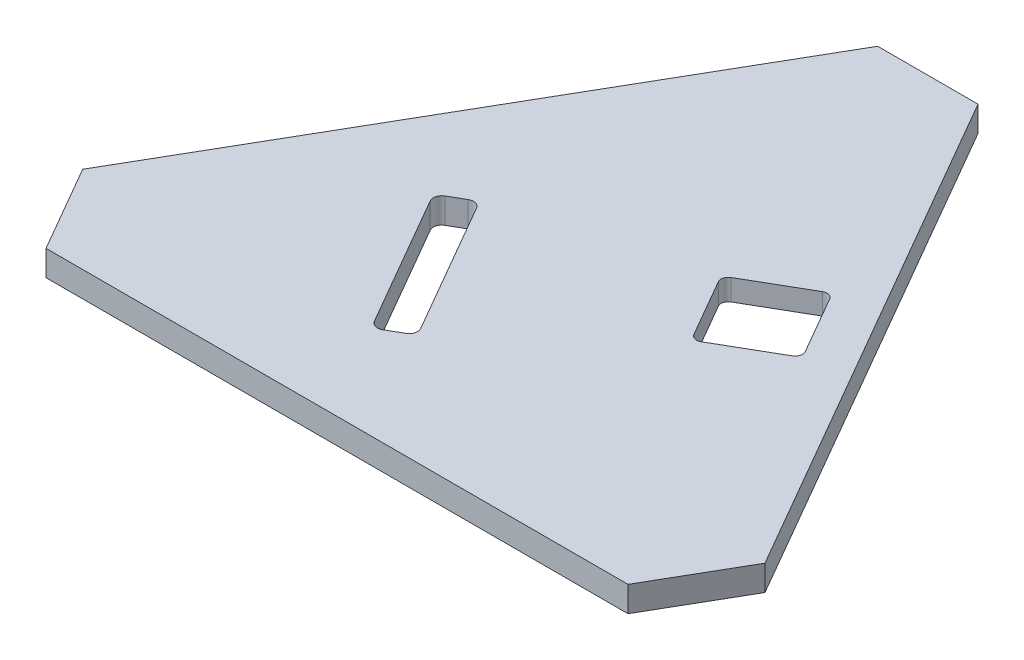
ISO-10303-21;
HEADER;
FILE_DESCRIPTION(('STEP AP214'),'2;1');
FILE_NAME('part.step','',(''),(''),'','','');
FILE_SCHEMA(('AUTOMOTIVE_DESIGN { 1 0 10303 214 1 1 1 1 }'));
ENDSEC;
DATA;
#1=APPLICATION_CONTEXT('core data for automotive mechanical design processes');
#2=APPLICATION_PROTOCOL_DEFINITION('international standard','automotive_design',2000,#1);
#3=PRODUCT_CONTEXT('',#1,'mechanical');
#4=PRODUCT('Part','Part','',(#3));
#5=PRODUCT_RELATED_PRODUCT_CATEGORY('part','',(#4));
#6=PRODUCT_DEFINITION_FORMATION('','',#4);
#7=PRODUCT_DEFINITION_CONTEXT('part definition',#1,'design');
#8=PRODUCT_DEFINITION('design','',#6,#7);
#9=PRODUCT_DEFINITION_SHAPE('','',#8);
#10=(LENGTH_UNIT() NAMED_UNIT(*) SI_UNIT(.MILLI.,.METRE.));
#11=(NAMED_UNIT(*) PLANE_ANGLE_UNIT() SI_UNIT($,.RADIAN.));
#12=(NAMED_UNIT(*) SI_UNIT($,.STERADIAN.) SOLID_ANGLE_UNIT());
#13=UNCERTAINTY_MEASURE_WITH_UNIT(LENGTH_MEASURE(1.E-05),#10,'distance_accuracy_value','');
#14=(GEOMETRIC_REPRESENTATION_CONTEXT(3) GLOBAL_UNCERTAINTY_ASSIGNED_CONTEXT((#13)) GLOBAL_UNIT_ASSIGNED_CONTEXT((#10,
#11,#12)) REPRESENTATION_CONTEXT('',''));
#15=CARTESIAN_POINT('',(0.,0.,0.));
#16=DIRECTION('',(0.,0.,1.));
#17=DIRECTION('',(1.,0.,0.));
#18=AXIS2_PLACEMENT_3D('',#15,#16,#17);
#19=CARTESIAN_POINT('',(1577.09998333721,19.05,13173.8984050004));
#20=DIRECTION('',(-0.866025403784439,0.,0.499999999999999));
#21=DIRECTION('',(0.499999999999999,0.,0.866025403784439));
#22=AXIS2_PLACEMENT_3D('',#19,#20,#21);
#23=PLANE('',#22);
#24=DIRECTION('',(-0.499999999999999,0.,-0.866025403784439));
#25=VECTOR('',#24,1.);
#26=CARTESIAN_POINT('',(1577.09998333721,0.,13173.8984050004));
#27=LINE('',#26,#25);
#28=CARTESIAN_POINT('',(1577.09998333721,0.,13173.8984050004));
#29=VERTEX_POINT('',#28);
#30=CARTESIAN_POINT('',(1359.2891177106,0.,12796.6389192945));
#31=VERTEX_POINT('',#30);
#32=EDGE_CURVE('E398',#29,#31,#27,.T.);
#33=ORIENTED_EDGE('',*,*,#32,.T.);
#34=DIRECTION('',(0.,-1.,0.));
#35=VECTOR('',#34,1.);
#36=CARTESIAN_POINT('',(1359.2891177106,19.05,12796.6389192945));
#37=LINE('',#36,#35);
#38=CARTESIAN_POINT('',(1359.2891177106,19.05,12796.6389192945));
#39=VERTEX_POINT('',#38);
#40=EDGE_CURVE('E45',#39,#31,#37,.T.);
#41=ORIENTED_EDGE('',*,*,#40,.F.);
#42=DIRECTION('',(-0.499999999999999,0.,-0.866025403784439));
#43=VECTOR('',#42,1.);
#44=CARTESIAN_POINT('',(1577.09998333721,19.05,13173.8984050004));
#45=LINE('',#44,#43);
#46=CARTESIAN_POINT('',(1577.09998333721,19.05,13173.8984050004));
#47=VERTEX_POINT('',#46);
#48=EDGE_CURVE('E412',#47,#39,#45,.T.);
#49=ORIENTED_EDGE('',*,*,#48,.F.);
#50=DIRECTION('',(0.,-1.,0.));
#51=VECTOR('',#50,1.);
#52=CARTESIAN_POINT('',(1577.09998333721,19.05,13173.8984050004));
#53=LINE('',#52,#51);
#54=EDGE_CURVE('E426',#47,#29,#53,.T.);
#55=ORIENTED_EDGE('',*,*,#54,.T.);
#56=EDGE_LOOP('',(#33,#41,#49,#55));
#57=FACE_BOUND('',#56,.T.);
#58=ADVANCED_FACE('F38',(#57),#23,.F.);
#59=CARTESIAN_POINT('',(1359.2891177106,19.05,12796.6389192945));
#60=DIRECTION('',(0.,0.,1.));
#61=DIRECTION('',(1.,0.,0.));
#62=AXIS2_PLACEMENT_3D('',#59,#60,#61);
#63=PLANE('',#62);
#64=DIRECTION('',(-1.,0.,0.));
#65=VECTOR('',#64,1.);
#66=CARTESIAN_POINT('',(1359.2891177106,0.,12796.6389192945));
#67=LINE('',#66,#65);
#68=CARTESIAN_POINT('',(1284.23263960455,0.,12796.6389192945));
#69=VERTEX_POINT('',#68);
#70=EDGE_CURVE('E429',#31,#69,#67,.T.);
#71=ORIENTED_EDGE('',*,*,#70,.T.);
#72=DIRECTION('',(0.,-1.,0.));
#73=VECTOR('',#72,1.);
#74=CARTESIAN_POINT('',(1284.23263960455,19.05,12796.6389192945));
#75=LINE('',#74,#73);
#76=CARTESIAN_POINT('',(1284.23263960455,19.05,12796.6389192945));
#77=VERTEX_POINT('',#76);
#78=EDGE_CURVE('E449',#77,#69,#75,.T.);
#79=ORIENTED_EDGE('',*,*,#78,.F.);
#80=DIRECTION('',(-1.,0.,0.));
#81=VECTOR('',#80,1.);
#82=CARTESIAN_POINT('',(1359.2891177106,19.05,12796.6389192945));
#83=LINE('',#82,#81);
#84=EDGE_CURVE('E415',#39,#77,#83,.T.);
#85=ORIENTED_EDGE('',*,*,#84,.F.);
#86=ORIENTED_EDGE('',*,*,#40,.T.);
#87=EDGE_LOOP('',(#71,#79,#85,#86));
#88=FACE_BOUND('',#87,.T.);
#89=ADVANCED_FACE('F454',(#88),#63,.F.);
#90=CARTESIAN_POINT('',(1284.23263960455,19.05,12796.6389192945));
#91=DIRECTION('',(0.866025403784439,0.,0.5));
#92=DIRECTION('',(0.5,0.,-0.866025403784438));
#93=AXIS2_PLACEMENT_3D('',#90,#91,#92);
#94=PLANE('',#93);
#95=DIRECTION('',(-0.5,0.,0.866025403784438));
#96=VECTOR('',#95,1.);
#97=CARTESIAN_POINT('',(1284.23263960455,0.,12796.6389192945));
#98=LINE('',#97,#96);
#99=CARTESIAN_POINT('',(1066.4217739783,0.,13173.8984049997));
#100=VERTEX_POINT('',#99);
#101=EDGE_CURVE('E431',#69,#100,#98,.T.);
#102=ORIENTED_EDGE('',*,*,#101,.T.);
#103=DIRECTION('',(0.,-1.,0.));
#104=VECTOR('',#103,1.);
#105=CARTESIAN_POINT('',(1066.4217739783,19.05,13173.8984049997));
#106=LINE('',#105,#104);
#107=CARTESIAN_POINT('',(1066.4217739783,19.05,13173.8984049997));
#108=VERTEX_POINT('',#107);
#109=EDGE_CURVE('E446',#108,#100,#106,.T.);
#110=ORIENTED_EDGE('',*,*,#109,.F.);
#111=DIRECTION('',(-0.5,0.,0.866025403784438));
#112=VECTOR('',#111,1.);
#113=CARTESIAN_POINT('',(1284.23263960455,19.05,12796.6389192945));
#114=LINE('',#113,#112);
#115=EDGE_CURVE('E418',#77,#108,#114,.T.);
#116=ORIENTED_EDGE('',*,*,#115,.F.);
#117=ORIENTED_EDGE('',*,*,#78,.T.);
#118=EDGE_LOOP('',(#102,#110,#116,#117));
#119=FACE_BOUND('',#118,.T.);
#120=ADVANCED_FACE('F468',(#119),#94,.F.);
#121=CARTESIAN_POINT('',(1066.4217739783,19.05,13173.8984049997));
#122=DIRECTION('',(0.866025403784449,0.,-0.499999999999983));
#123=DIRECTION('',(-0.499999999999983,0.,-0.866025403784449));
#124=AXIS2_PLACEMENT_3D('',#121,#122,#123);
#125=PLANE('',#124);
#126=DIRECTION('',(0.499999999999983,0.,0.866025403784449));
#127=VECTOR('',#126,1.);
#128=CARTESIAN_POINT('',(1066.4217739783,0.,13173.8984049997));
#129=LINE('',#128,#127);
#130=CARTESIAN_POINT('',(1103.95001303204,0.,13238.8992217594));
#131=VERTEX_POINT('',#130);
#132=EDGE_CURVE('E433',#100,#131,#129,.T.);
#133=ORIENTED_EDGE('',*,*,#132,.T.);
#134=DIRECTION('',(0.,-1.,0.));
#135=VECTOR('',#134,1.);
#136=CARTESIAN_POINT('',(1103.95001303204,19.05,13238.8992217594));
#137=LINE('',#136,#135);
#138=CARTESIAN_POINT('',(1103.95001303204,19.05,13238.8992217594));
#139=VERTEX_POINT('',#138);
#140=EDGE_CURVE('E443',#139,#131,#137,.T.);
#141=ORIENTED_EDGE('',*,*,#140,.F.);
#142=DIRECTION('',(0.499999999999983,0.,0.866025403784449));
#143=VECTOR('',#142,1.);
#144=CARTESIAN_POINT('',(1066.4217739783,19.05,13173.8984049997));
#145=LINE('',#144,#143);
#146=EDGE_CURVE('E420',#108,#139,#145,.T.);
#147=ORIENTED_EDGE('',*,*,#146,.F.);
#148=ORIENTED_EDGE('',*,*,#109,.T.);
#149=EDGE_LOOP('',(#133,#141,#147,#148));
#150=FACE_BOUND('',#149,.T.);
#151=ADVANCED_FACE('F472',(#150),#125,.F.);
#152=CARTESIAN_POINT('',(1103.95001303204,19.05,13238.8992217594));
#153=DIRECTION('',(0.,0.,-1.));
#154=DIRECTION('',(-1.,0.,0.));
#155=AXIS2_PLACEMENT_3D('',#152,#153,#154);
#156=PLANE('',#155);
#157=DIRECTION('',(1.,0.,0.));
#158=VECTOR('',#157,1.);
#159=CARTESIAN_POINT('',(1103.95001303204,0.,13238.8992217594));
#160=LINE('',#159,#158);
#161=CARTESIAN_POINT('',(1539.57174428383,0.,13238.8992217594));
#162=VERTEX_POINT('',#161);
#163=EDGE_CURVE('E435',#131,#162,#160,.T.);
#164=ORIENTED_EDGE('',*,*,#163,.T.);
#165=DIRECTION('',(0.,-1.,0.));
#166=VECTOR('',#165,1.);
#167=CARTESIAN_POINT('',(1539.57174428383,19.05,13238.8992217594));
#168=LINE('',#167,#166);
#169=CARTESIAN_POINT('',(1539.57174428383,19.05,13238.8992217594));
#170=VERTEX_POINT('',#169);
#171=EDGE_CURVE('E440',#170,#162,#168,.T.);
#172=ORIENTED_EDGE('',*,*,#171,.F.);
#173=DIRECTION('',(1.,0.,0.));
#174=VECTOR('',#173,1.);
#175=CARTESIAN_POINT('',(1103.95001303204,19.05,13238.8992217594));
#176=LINE('',#175,#174);
#177=EDGE_CURVE('E422',#139,#170,#176,.T.);
#178=ORIENTED_EDGE('',*,*,#177,.F.);
#179=ORIENTED_EDGE('',*,*,#140,.T.);
#180=EDGE_LOOP('',(#164,#172,#178,#179));
#181=FACE_BOUND('',#180,.T.);
#182=ADVANCED_FACE('F481',(#181),#156,.F.);
#183=CARTESIAN_POINT('',(1539.57174428383,19.05,13238.8992217594));
#184=DIRECTION('',(-0.866025403784441,0.,-0.499999999999997));
#185=DIRECTION('',(-0.499999999999997,0.,0.866025403784441));
#186=AXIS2_PLACEMENT_3D('',#183,#184,#185);
#187=PLANE('',#186);
#188=DIRECTION('',(0.499999999999997,0.,-0.866025403784441));
#189=VECTOR('',#188,1.);
#190=CARTESIAN_POINT('',(1539.57174428383,0.,13238.8992217594));
#191=LINE('',#190,#189);
#192=EDGE_CURVE('E416',#162,#29,#191,.T.);
#193=ORIENTED_EDGE('',*,*,#192,.T.);
#194=ORIENTED_EDGE('',*,*,#54,.F.);
#195=DIRECTION('',(0.499999999999997,0.,-0.866025403784441));
#196=VECTOR('',#195,1.);
#197=CARTESIAN_POINT('',(1539.57174428383,19.05,13238.8992217594));
#198=LINE('',#197,#196);
#199=EDGE_CURVE('E424',#170,#47,#198,.T.);
#200=ORIENTED_EDGE('',*,*,#199,.F.);
#201=ORIENTED_EDGE('',*,*,#171,.T.);
#202=EDGE_LOOP('',(#193,#194,#200,#201));
#203=FACE_BOUND('',#202,.T.);
#204=ADVANCED_FACE('F479',(#203),#187,.F.);
#205=CARTESIAN_POINT('',(0.,19.05,0.));
#206=DIRECTION('',(0.,1.,0.));
#207=DIRECTION('',(0.,0.,1.));
#208=AXIS2_PLACEMENT_3D('',#205,#206,#207);
#209=PLANE('',#208);
#210=CARTESIAN_POINT('',(1279.61369632783,19.05,13160.136945889));
#211=DIRECTION('',(0.,1.,0.));
#212=DIRECTION('',(0.,0.,-1.));
#213=AXIS2_PLACEMENT_3D('',#210,#211,#212);
#214=CIRCLE('',#213,6.34999999999939);
#215=CARTESIAN_POINT('',(1274.1144350138,19.05,13163.311945889));
#216=VERTEX_POINT('',#215);
#217=CARTESIAN_POINT('',(1282.78869632783,19.05,13165.6362072031));
#218=VERTEX_POINT('',#217);
#219=EDGE_CURVE('E52',#216,#218,#214,.T.);
#220=ORIENTED_EDGE('',*,*,#219,.F.);
#221=DIRECTION('',(0.500000000000004,0.,0.866025403784436));
#222=VECTOR('',#221,1.);
#223=CARTESIAN_POINT('',(1216.9644350138,19.05,13064.3252422365));
#224=LINE('',#223,#222);
#225=CARTESIAN_POINT('',(1216.9644350138,19.05,13064.3252422365));
#226=VERTEX_POINT('',#225);
#227=EDGE_CURVE('E268',#226,#216,#224,.T.);
#228=ORIENTED_EDGE('',*,*,#227,.F.);
#229=CARTESIAN_POINT('',(1222.46369632783,19.05,13061.1502422365));
#230=DIRECTION('',(0.,1.,0.));
#231=DIRECTION('',(0.,0.,-1.));
#232=AXIS2_PLACEMENT_3D('',#229,#230,#231);
#233=CIRCLE('',#232,6.35000000000039);
#234=CARTESIAN_POINT('',(1219.28869632783,19.05,13055.6509809224));
#235=VERTEX_POINT('',#234);
#236=EDGE_CURVE('E265',#235,#226,#233,.T.);
#237=ORIENTED_EDGE('',*,*,#236,.F.);
#238=DIRECTION('',(-0.866025403784465,0.,0.499999999999955));
#239=VECTOR('',#238,1.);
#240=CARTESIAN_POINT('',(1219.28869632783,19.05,13055.6509809224));
#241=LINE('',#240,#239);
#242=CARTESIAN_POINT('',(1230.2872189559,19.05,13049.3009809224));
#243=VERTEX_POINT('',#242);
#244=EDGE_CURVE('E262',#243,#235,#241,.T.);
#245=ORIENTED_EDGE('',*,*,#244,.F.);
#246=CARTESIAN_POINT('',(1233.4622189559,19.05,13054.8002422365));
#247=DIRECTION('',(0.,1.,0.));
#248=DIRECTION('',(0.,0.,1.));
#249=AXIS2_PLACEMENT_3D('',#246,#247,#248);
#250=CIRCLE('',#249,6.34999999999939);
#251=CARTESIAN_POINT('',(1238.96148026993,19.05,13051.6252422365));
#252=VERTEX_POINT('',#251);
#253=EDGE_CURVE('E256',#252,#243,#250,.T.);
#254=ORIENTED_EDGE('',*,*,#253,.F.);
#255=DIRECTION('',(-0.500000000000004,0.,-0.866025403784436));
#256=VECTOR('',#255,1.);
#257=CARTESIAN_POINT('',(1238.96148026993,19.05,13051.6252422365));
#258=LINE('',#257,#256);
#259=CARTESIAN_POINT('',(1296.11148026993,19.05,13150.611945889));
#260=VERTEX_POINT('',#259);
#261=EDGE_CURVE('E254',#260,#252,#258,.T.);
#262=ORIENTED_EDGE('',*,*,#261,.F.);
#263=CARTESIAN_POINT('',(1290.6122189559,19.05,13153.786945889));
#264=DIRECTION('',(0.,1.,0.));
#265=DIRECTION('',(0.,0.,-1.));
#266=AXIS2_PLACEMENT_3D('',#263,#264,#265);
#267=CIRCLE('',#266,6.35000000000039);
#268=CARTESIAN_POINT('',(1293.7872189559,19.05,13159.2862072031));
#269=VERTEX_POINT('',#268);
#270=EDGE_CURVE('E237',#269,#260,#267,.T.);
#271=ORIENTED_EDGE('',*,*,#270,.F.);
#272=DIRECTION('',(0.866025403784465,0.,-0.499999999999955));
#273=VECTOR('',#272,1.);
#274=CARTESIAN_POINT('',(1282.78869632783,19.05,13165.6362072031));
#275=LINE('',#274,#273);
#276=EDGE_CURVE('E246',#218,#269,#275,.T.);
#277=ORIENTED_EDGE('',*,*,#276,.F.);
#278=EDGE_LOOP('',(#220,#228,#237,#245,#254,#262,#271,#277));
#279=FACE_BOUND('',#278,.T.);
#280=DIRECTION('',(0.499999999670903,0.,0.866025403974443));
#281=VECTOR('',#280,1.);
#282=CARTESIAN_POINT('',(-4600.10221260763,19.05,2655.87024841804));
#283=LINE('',#282,#281);
#284=CARTESIAN_POINT('',(1377.23266474137,19.05,13008.9179589257));
#285=VERTEX_POINT('',#284);
#286=CARTESIAN_POINT('',(1402.23266477114,19.05,13052.2192291855));
#287=VERTEX_POINT('',#286);
#288=EDGE_CURVE('E371',#285,#287,#283,.T.);
#289=ORIENTED_EDGE('',*,*,#288,.F.);
#290=CARTESIAN_POINT('',(1381.99580444573,19.05,13006.1679589352));
#291=DIRECTION('',(0.,1.,0.));
#292=DIRECTION('',(0.,0.,1.));
#293=AXIS2_PLACEMENT_3D('',#290,#291,#292);
#294=CIRCLE('',#293,5.49999997149939);
#295=CARTESIAN_POINT('',(1379.24580446473,19.05,13001.4048192473));
#296=VERTEX_POINT('',#295);
#297=EDGE_CURVE('E392',#296,#285,#294,.T.);
#298=ORIENTED_EDGE('',*,*,#297,.F.);
#299=DIRECTION('',(-0.866025403594434,0.,0.500000000329097));
#300=VECTOR('',#299,1.);
#301=CARTESIAN_POINT('',(5974.58488321722,19.05,10348.2845627836));
#302=LINE('',#301,#300);
#303=CARTESIAN_POINT('',(1422.54707464445,19.05,12976.4048192309));
#304=VERTEX_POINT('',#303);
#305=EDGE_CURVE('E389',#304,#296,#302,.T.);
#306=ORIENTED_EDGE('',*,*,#305,.F.);
#307=CARTESIAN_POINT('',(1425.29707463495,19.05,12981.1679589352));
#308=DIRECTION('',(0.,1.,0.));
#309=DIRECTION('',(0.,0.,1.));
#310=AXIS2_PLACEMENT_3D('',#307,#308,#309);
#311=CIRCLE('',#310,5.49999998099929);
#312=CARTESIAN_POINT('',(1430.06021433931,19.05,12978.4179589447));
#313=VERTEX_POINT('',#312);
#314=EDGE_CURVE('E386',#313,#304,#311,.T.);
#315=ORIENTED_EDGE('',*,*,#314,.F.);
#316=DIRECTION('',(-0.499999999999995,0.,-0.866025403784442));
#317=VECTOR('',#316,1.);
#318=CARTESIAN_POINT('',(-4547.27466593463,19.05,2625.37025245649));
#319=LINE('',#318,#317);
#320=CARTESIAN_POINT('',(1455.06021437731,19.05,13021.7192291998));
#321=VERTEX_POINT('',#320);
#322=EDGE_CURVE('E383',#321,#313,#319,.T.);
#323=ORIENTED_EDGE('',*,*,#322,.F.);
#324=CARTESIAN_POINT('',(1450.29707467295,19.05,13024.4692291903));
#325=DIRECTION('',(0.,1.,0.));
#326=DIRECTION('',(0.,0.,1.));
#327=AXIS2_PLACEMENT_3D('',#324,#325,#326);
#328=CIRCLE('',#327,5.49999997149939);
#329=CARTESIAN_POINT('',(1453.04707465395,19.05,13029.2323688782));
#330=VERTEX_POINT('',#329);
#331=EDGE_CURVE('E380',#330,#321,#328,.T.);
#332=ORIENTED_EDGE('',*,*,#331,.F.);
#333=DIRECTION('',(0.866025403594434,0.,-0.500000000329097));
#334=VECTOR('',#333,1.);
#335=CARTESIAN_POINT('',(6005.08488324679,19.05,10401.1121124193));
#336=LINE('',#335,#334);
#337=CARTESIAN_POINT('',(1409.74580447423,19.05,13054.2323688946));
#338=VERTEX_POINT('',#337);
#339=EDGE_CURVE('E377',#338,#330,#336,.T.);
#340=ORIENTED_EDGE('',*,*,#339,.F.);
#341=CARTESIAN_POINT('',(1406.99580448373,19.05,13049.4692291903));
#342=DIRECTION('',(0.,1.,0.));
#343=DIRECTION('',(0.,0.,1.));
#344=AXIS2_PLACEMENT_3D('',#341,#342,#343);
#345=CIRCLE('',#344,5.49999999049934);
#346=EDGE_CURVE('E374',#287,#338,#345,.T.);
#347=ORIENTED_EDGE('',*,*,#346,.F.);
#348=EDGE_LOOP('',(#289,#298,#306,#315,#323,#332,#340,#347));
#349=FACE_BOUND('',#348,.T.);
#350=ORIENTED_EDGE('',*,*,#48,.T.);
#351=ORIENTED_EDGE('',*,*,#84,.T.);
#352=ORIENTED_EDGE('',*,*,#115,.T.);
#353=ORIENTED_EDGE('',*,*,#146,.T.);
#354=ORIENTED_EDGE('',*,*,#177,.T.);
#355=ORIENTED_EDGE('',*,*,#199,.T.);
#356=EDGE_LOOP('',(#350,#351,#352,#353,#354,#355));
#357=FACE_BOUND('',#356,.T.);
#358=ADVANCED_FACE('F250',(#279,#349,#357),#209,.T.);
#359=CARTESIAN_POINT('',(0.,0.,0.));
#360=DIRECTION('',(0.,1.,0.));
#361=DIRECTION('',(0.,0.,1.));
#362=AXIS2_PLACEMENT_3D('',#359,#360,#361);
#363=PLANE('',#362);
#364=DIRECTION('',(-0.500000000000004,0.,-0.866025403784436));
#365=VECTOR('',#364,1.);
#366=CARTESIAN_POINT('',(1216.9644350138,0.,13064.3252422365));
#367=LINE('',#366,#365);
#368=CARTESIAN_POINT('',(1274.1144350138,0.,13163.311945889));
#369=VERTEX_POINT('',#368);
#370=CARTESIAN_POINT('',(1216.9644350138,0.,13064.3252422365));
#371=VERTEX_POINT('',#370);
#372=EDGE_CURVE('E776',#369,#371,#367,.T.);
#373=ORIENTED_EDGE('',*,*,#372,.F.);
#374=CARTESIAN_POINT('',(1279.61369632783,0.,13160.136945889));
#375=DIRECTION('',(0.,1.,0.));
#376=DIRECTION('',(0.,0.,1.));
#377=AXIS2_PLACEMENT_3D('',#374,#375,#376);
#378=CIRCLE('',#377,6.34999999999939);
#379=CARTESIAN_POINT('',(1282.78869632783,0.,13165.6362072031));
#380=VERTEX_POINT('',#379);
#381=EDGE_CURVE('E286',#380,#369,#378,.F.);
#382=ORIENTED_EDGE('',*,*,#381,.F.);
#383=DIRECTION('',(-0.866025403784465,0.,0.499999999999955));
#384=VECTOR('',#383,1.);
#385=CARTESIAN_POINT('',(1282.78869632783,0.,13165.6362072031));
#386=LINE('',#385,#384);
#387=CARTESIAN_POINT('',(1293.7872189559,0.,13159.2862072031));
#388=VERTEX_POINT('',#387);
#389=EDGE_CURVE('E283',#388,#380,#386,.T.);
#390=ORIENTED_EDGE('',*,*,#389,.F.);
#391=CARTESIAN_POINT('',(1290.6122189559,0.,13153.786945889));
#392=DIRECTION('',(0.,1.,0.));
#393=DIRECTION('',(0.,0.,1.));
#394=AXIS2_PLACEMENT_3D('',#391,#392,#393);
#395=CIRCLE('',#394,6.35000000000039);
#396=CARTESIAN_POINT('',(1296.11148026993,0.,13150.611945889));
#397=VERTEX_POINT('',#396);
#398=EDGE_CURVE('E240',#397,#388,#395,.F.);
#399=ORIENTED_EDGE('',*,*,#398,.F.);
#400=DIRECTION('',(0.500000000000004,0.,0.866025403784436));
#401=VECTOR('',#400,1.);
#402=CARTESIAN_POINT('',(1238.96148026993,0.,13051.6252422365));
#403=LINE('',#402,#401);
#404=CARTESIAN_POINT('',(1238.96148026993,0.,13051.6252422365));
#405=VERTEX_POINT('',#404);
#406=EDGE_CURVE('E762',#405,#397,#403,.T.);
#407=ORIENTED_EDGE('',*,*,#406,.F.);
#408=CARTESIAN_POINT('',(1233.4622189559,0.,13054.8002422365));
#409=DIRECTION('',(0.,1.,0.));
#410=DIRECTION('',(0.,0.,1.));
#411=AXIS2_PLACEMENT_3D('',#408,#409,#410);
#412=CIRCLE('',#411,6.34999999999939);
#413=CARTESIAN_POINT('',(1230.2872189559,0.,13049.3009809224));
#414=VERTEX_POINT('',#413);
#415=EDGE_CURVE('E764',#414,#405,#412,.F.);
#416=ORIENTED_EDGE('',*,*,#415,.F.);
#417=DIRECTION('',(0.866025403784465,0.,-0.499999999999955));
#418=VECTOR('',#417,1.);
#419=CARTESIAN_POINT('',(1219.28869632783,0.,13055.6509809224));
#420=LINE('',#419,#418);
#421=CARTESIAN_POINT('',(1219.28869632783,0.,13055.6509809224));
#422=VERTEX_POINT('',#421);
#423=EDGE_CURVE('E772',#422,#414,#420,.T.);
#424=ORIENTED_EDGE('',*,*,#423,.F.);
#425=CARTESIAN_POINT('',(1222.46369632783,0.,13061.1502422365));
#426=DIRECTION('',(0.,1.,0.));
#427=DIRECTION('',(0.,0.,1.));
#428=AXIS2_PLACEMENT_3D('',#425,#426,#427);
#429=CIRCLE('',#428,6.35000000000039);
#430=EDGE_CURVE('E774',#371,#422,#429,.F.);
#431=ORIENTED_EDGE('',*,*,#430,.F.);
#432=EDGE_LOOP('',(#373,#382,#390,#399,#407,#416,#424,#431));
#433=FACE_BOUND('',#432,.T.);
#434=DIRECTION('',(0.500000000000007,0.,0.866025403784435));
#435=VECTOR('',#434,1.);
#436=CARTESIAN_POINT('',(1432.87546841956,0.,12963.2941219719));
#437=LINE('',#436,#435);
#438=CARTESIAN_POINT('',(1432.87546841956,0.,12963.2941219719));
#439=VERTEX_POINT('',#438);
#440=CARTESIAN_POINT('',(1469.56546843856,0.,13026.8430661346));
#441=VERTEX_POINT('',#440);
#442=EDGE_CURVE('E314',#439,#441,#437,.T.);
#443=ORIENTED_EDGE('',*,*,#442,.F.);
#444=CARTESIAN_POINT('',(1429.57591163114,0.,12965.1991219719));
#445=DIRECTION('',(0.,-1.,0.));
#446=DIRECTION('',(0.,0.,1.));
#447=AXIS2_PLACEMENT_3D('',#444,#445,#446);
#448=CIRCLE('',#447,3.80999999999994);
#449=CARTESIAN_POINT('',(1427.67091163114,0.,12961.8995651835));
#450=VERTEX_POINT('',#449);
#451=EDGE_CURVE('E285',#450,#439,#448,.T.);
#452=ORIENTED_EDGE('',*,*,#451,.F.);
#453=DIRECTION('',(0.866025403784449,0.,-0.499999999999983));
#454=VECTOR('',#453,1.);
#455=CARTESIAN_POINT('',(1427.67091163114,0.,12961.8995651835));
#456=LINE('',#455,#454);
#457=CARTESIAN_POINT('',(1364.12196746853,0.,12998.5895652025));
#458=VERTEX_POINT('',#457);
#459=EDGE_CURVE('E291',#458,#450,#456,.T.);
#460=ORIENTED_EDGE('',*,*,#459,.F.);
#461=CARTESIAN_POINT('',(1366.02696746853,0.,13001.8891219909));
#462=DIRECTION('',(0.,-1.,0.));
#463=DIRECTION('',(0.,0.,1.));
#464=AXIS2_PLACEMENT_3D('',#461,#462,#463);
#465=CIRCLE('',#464,3.81000000000021);
#466=CARTESIAN_POINT('',(1362.72741068011,0.,13003.7941219909));
#467=VERTEX_POINT('',#466);
#468=EDGE_CURVE('E329',#467,#458,#465,.T.);
#469=ORIENTED_EDGE('',*,*,#468,.F.);
#470=DIRECTION('',(-0.500000000000005,0.,-0.866025403784436));
#471=VECTOR('',#470,1.);
#472=CARTESIAN_POINT('',(1362.72741068011,0.,13003.7941219909));
#473=LINE('',#472,#471);
#474=CARTESIAN_POINT('',(1399.41741069911,0.,13067.3430661536));
#475=VERTEX_POINT('',#474);
#476=EDGE_CURVE('E326',#475,#467,#473,.T.);
#477=ORIENTED_EDGE('',*,*,#476,.F.);
#478=CARTESIAN_POINT('',(1402.71696748753,0.,13065.4380661536));
#479=DIRECTION('',(0.,-1.,0.));
#480=DIRECTION('',(0.,0.,1.));
#481=AXIS2_PLACEMENT_3D('',#478,#479,#480);
#482=CIRCLE('',#481,3.80999999999994);
#483=CARTESIAN_POINT('',(1404.62196748753,0.,13068.737622942));
#484=VERTEX_POINT('',#483);
#485=EDGE_CURVE('E323',#484,#475,#482,.T.);
#486=ORIENTED_EDGE('',*,*,#485,.F.);
#487=DIRECTION('',(-0.866025403784449,0.,0.499999999999982));
#488=VECTOR('',#487,1.);
#489=CARTESIAN_POINT('',(1468.17091165015,0.,13032.047622923));
#490=LINE('',#489,#488);
#491=CARTESIAN_POINT('',(1468.17091165014,0.,13032.047622923));
#492=VERTEX_POINT('',#491);
#493=EDGE_CURVE('E320',#492,#484,#490,.T.);
#494=ORIENTED_EDGE('',*,*,#493,.F.);
#495=CARTESIAN_POINT('',(1466.26591165015,0.,13028.7480661346));
#496=DIRECTION('',(0.,-1.,0.));
#497=DIRECTION('',(0.,0.,-1.));
#498=AXIS2_PLACEMENT_3D('',#495,#496,#497);
#499=CIRCLE('',#498,3.81000000000021);
#500=EDGE_CURVE('E317',#441,#492,#499,.T.);
#501=ORIENTED_EDGE('',*,*,#500,.F.);
#502=EDGE_LOOP('',(#443,#452,#460,#469,#477,#486,#494,#501));
#503=FACE_BOUND('',#502,.T.);
#504=ORIENTED_EDGE('',*,*,#32,.F.);
#505=ORIENTED_EDGE('',*,*,#192,.F.);
#506=ORIENTED_EDGE('',*,*,#163,.F.);
#507=ORIENTED_EDGE('',*,*,#132,.F.);
#508=ORIENTED_EDGE('',*,*,#101,.F.);
#509=ORIENTED_EDGE('',*,*,#70,.F.);
#510=EDGE_LOOP('',(#504,#505,#506,#507,#508,#509));
#511=FACE_BOUND('',#510,.T.);
#512=ADVANCED_FACE('F462',(#433,#503,#511),#363,.F.);
#513=CARTESIAN_POINT('',(-4600.10221260763,-0.949999999999996,2655.87024841804));
#514=DIRECTION('',(-0.866025403974443,0.,0.499999999670903));
#515=DIRECTION('',(0.499999999670903,0.,0.866025403974443));
#516=AXIS2_PLACEMENT_3D('',#513,#514,#515);
#517=PLANE('',#516);
#518=DIRECTION('',(0.,1.,0.));
#519=VECTOR('',#518,1.);
#520=CARTESIAN_POINT('',(1402.23266476291,-0.949999999999996,13052.2192291903));
#521=LINE('',#520,#519);
#522=CARTESIAN_POINT('',(1402.23266476291,3.175,13052.2192291903));
#523=VERTEX_POINT('',#522);
#524=EDGE_CURVE('E395',#523,#287,#521,.T.);
#525=ORIENTED_EDGE('',*,*,#524,.F.);
#526=DIRECTION('',(-0.499999999670903,0.,-0.866025403974443));
#527=VECTOR('',#526,1.);
#528=CARTESIAN_POINT('',(-4600.10221260763,3.175,2655.87024841804));
#529=LINE('',#528,#527);
#530=CARTESIAN_POINT('',(1377.23266474959,3.175,13008.917958921));
#531=VERTEX_POINT('',#530);
#532=EDGE_CURVE('E368',#523,#531,#529,.T.);
#533=ORIENTED_EDGE('',*,*,#532,.T.);
#534=DIRECTION('',(0.,1.,0.));
#535=VECTOR('',#534,1.);
#536=CARTESIAN_POINT('',(1377.23266474137,-0.949999999999996,13008.9179589257));
#537=LINE('',#536,#535);
#538=EDGE_CURVE('E396',#531,#285,#537,.T.);
#539=ORIENTED_EDGE('',*,*,#538,.T.);
#540=ORIENTED_EDGE('',*,*,#288,.T.);
#541=EDGE_LOOP('',(#525,#533,#539,#540));
#542=FACE_BOUND('',#541,.T.);
#543=ADVANCED_FACE('F521',(#542),#517,.F.);
#544=CARTESIAN_POINT('',(1381.99580444573,-0.949999999999996,13006.1679589352));
#545=DIRECTION('',(0.,1.,0.));
#546=DIRECTION('',(0.,0.,1.));
#547=AXIS2_PLACEMENT_3D('',#544,#545,#546);
#548=CYLINDRICAL_SURFACE('',#547,5.49999997149939);
#549=ORIENTED_EDGE('',*,*,#538,.F.);
#550=CARTESIAN_POINT('',(1381.99580444573,3.175,13006.1679589352));
#551=DIRECTION('',(0.,1.,0.));
#552=DIRECTION('',(0.,0.,1.));
#553=AXIS2_PLACEMENT_3D('',#550,#551,#552);
#554=CIRCLE('',#553,5.49999997149939);
#555=CARTESIAN_POINT('',(1379.24580446473,3.175,13001.4048192473));
#556=VERTEX_POINT('',#555);
#557=EDGE_CURVE('E365',#531,#556,#554,.F.);
#558=ORIENTED_EDGE('',*,*,#557,.T.);
#559=DIRECTION('',(0.,1.,0.));
#560=VECTOR('',#559,1.);
#561=CARTESIAN_POINT('',(1379.24580446473,-0.949999999999996,13001.4048192473));
#562=LINE('',#561,#560);
#563=EDGE_CURVE('E399',#556,#296,#562,.T.);
#564=ORIENTED_EDGE('',*,*,#563,.T.);
#565=ORIENTED_EDGE('',*,*,#297,.T.);
#566=EDGE_LOOP('',(#549,#558,#564,#565));
#567=FACE_BOUND('',#566,.T.);
#568=ADVANCED_FACE('F525',(#567),#548,.F.);
#569=CARTESIAN_POINT('',(5974.58488321722,-0.949999999999996,10348.2845627836));
#570=DIRECTION('',(-0.500000000329097,0.,-0.866025403594434));
#571=DIRECTION('',(-0.866025403594434,0.,0.500000000329097));
#572=AXIS2_PLACEMENT_3D('',#569,#570,#571);
#573=PLANE('',#572);
#574=ORIENTED_EDGE('',*,*,#563,.F.);
#575=DIRECTION('',(0.866025403594434,0.,-0.500000000329097));
#576=VECTOR('',#575,1.);
#577=CARTESIAN_POINT('',(5974.58488321722,3.175,10348.2845627836));
#578=LINE('',#577,#576);
#579=CARTESIAN_POINT('',(1422.54707464445,3.175,12976.4048192309));
#580=VERTEX_POINT('',#579);
#581=EDGE_CURVE('E362',#556,#580,#578,.T.);
#582=ORIENTED_EDGE('',*,*,#581,.T.);
#583=DIRECTION('',(0.,1.,0.));
#584=VECTOR('',#583,1.);
#585=CARTESIAN_POINT('',(1422.54707464445,-0.949999999999996,12976.4048192309));
#586=LINE('',#585,#584);
#587=EDGE_CURVE('E401',#580,#304,#586,.T.);
#588=ORIENTED_EDGE('',*,*,#587,.T.);
#589=ORIENTED_EDGE('',*,*,#305,.T.);
#590=EDGE_LOOP('',(#574,#582,#588,#589));
#591=FACE_BOUND('',#590,.T.);
#592=ADVANCED_FACE('F534',(#591),#573,.F.);
#593=CARTESIAN_POINT('',(1425.29707463495,-0.949999999999996,12981.1679589352));
#594=DIRECTION('',(0.,1.,0.));
#595=DIRECTION('',(0.,0.,1.));
#596=AXIS2_PLACEMENT_3D('',#593,#594,#595);
#597=CYLINDRICAL_SURFACE('',#596,5.49999998099929);
#598=ORIENTED_EDGE('',*,*,#587,.F.);
#599=CARTESIAN_POINT('',(1425.29707463495,3.175,12981.1679589352));
#600=DIRECTION('',(0.,1.,0.));
#601=DIRECTION('',(0.,0.,1.));
#602=AXIS2_PLACEMENT_3D('',#599,#600,#601);
#603=CIRCLE('',#602,5.49999998099929);
#604=CARTESIAN_POINT('',(1430.06021433931,3.175,12978.4179589447));
#605=VERTEX_POINT('',#604);
#606=EDGE_CURVE('E359',#580,#605,#603,.F.);
#607=ORIENTED_EDGE('',*,*,#606,.T.);
#608=DIRECTION('',(0.,1.,0.));
#609=VECTOR('',#608,1.);
#610=CARTESIAN_POINT('',(1430.06021433931,-0.949999999999996,12978.4179589447));
#611=LINE('',#610,#609);
#612=EDGE_CURVE('E403',#605,#313,#611,.T.);
#613=ORIENTED_EDGE('',*,*,#612,.T.);
#614=ORIENTED_EDGE('',*,*,#314,.T.);
#615=EDGE_LOOP('',(#598,#607,#613,#614));
#616=FACE_BOUND('',#615,.T.);
#617=ADVANCED_FACE('F542',(#616),#597,.F.);
#618=CARTESIAN_POINT('',(-4547.27466593463,-0.949999999999996,2625.37025245649));
#619=DIRECTION('',(0.866025403784442,0.,-0.499999999999995));
#620=DIRECTION('',(-0.499999999999995,0.,-0.866025403784442));
#621=AXIS2_PLACEMENT_3D('',#618,#619,#620);
#622=PLANE('',#621);
#623=ORIENTED_EDGE('',*,*,#612,.F.);
#624=DIRECTION('',(0.499999999999995,0.,0.866025403784442));
#625=VECTOR('',#624,1.);
#626=CARTESIAN_POINT('',(-4547.27466593463,3.175,2625.37025245649));
#627=LINE('',#626,#625);
#628=CARTESIAN_POINT('',(1455.06021436908,3.175,13021.7192292045));
#629=VERTEX_POINT('',#628);
#630=EDGE_CURVE('E356',#605,#629,#627,.T.);
#631=ORIENTED_EDGE('',*,*,#630,.T.);
#632=DIRECTION('',(0.,1.,0.));
#633=VECTOR('',#632,1.);
#634=CARTESIAN_POINT('',(1455.06021437731,-0.949999999999996,13021.7192291998));
#635=LINE('',#634,#633);
#636=EDGE_CURVE('E405',#629,#321,#635,.T.);
#637=ORIENTED_EDGE('',*,*,#636,.T.);
#638=ORIENTED_EDGE('',*,*,#322,.T.);
#639=EDGE_LOOP('',(#623,#631,#637,#638));
#640=FACE_BOUND('',#639,.T.);
#641=ADVANCED_FACE('F550',(#640),#622,.F.);
#642=CARTESIAN_POINT('',(1450.29707467295,-0.949999999999996,13024.4692291903));
#643=DIRECTION('',(0.,1.,0.));
#644=DIRECTION('',(0.,0.,1.));
#645=AXIS2_PLACEMENT_3D('',#642,#643,#644);
#646=CYLINDRICAL_SURFACE('',#645,5.49999997149939);
#647=ORIENTED_EDGE('',*,*,#636,.F.);
#648=CARTESIAN_POINT('',(1450.29707467295,3.175,13024.4692291903));
#649=DIRECTION('',(0.,1.,0.));
#650=DIRECTION('',(0.,0.,1.));
#651=AXIS2_PLACEMENT_3D('',#648,#649,#650);
#652=CIRCLE('',#651,5.49999997149939);
#653=CARTESIAN_POINT('',(1453.04707465395,3.175,13029.2323688782));
#654=VERTEX_POINT('',#653);
#655=EDGE_CURVE('E353',#629,#654,#652,.F.);
#656=ORIENTED_EDGE('',*,*,#655,.T.);
#657=DIRECTION('',(0.,1.,0.));
#658=VECTOR('',#657,1.);
#659=CARTESIAN_POINT('',(1453.04707465395,-0.949999999999996,13029.2323688782));
#660=LINE('',#659,#658);
#661=EDGE_CURVE('E407',#654,#330,#660,.T.);
#662=ORIENTED_EDGE('',*,*,#661,.T.);
#663=ORIENTED_EDGE('',*,*,#331,.T.);
#664=EDGE_LOOP('',(#647,#656,#662,#663));
#665=FACE_BOUND('',#664,.T.);
#666=ADVANCED_FACE('F558',(#665),#646,.F.);
#667=CARTESIAN_POINT('',(6005.08488324679,-0.949999999999996,10401.1121124193));
#668=DIRECTION('',(0.500000000329097,0.,0.866025403594434));
#669=DIRECTION('',(0.866025403594434,0.,-0.500000000329097));
#670=AXIS2_PLACEMENT_3D('',#667,#668,#669);
#671=PLANE('',#670);
#672=ORIENTED_EDGE('',*,*,#661,.F.);
#673=DIRECTION('',(-0.866025403594434,0.,0.500000000329097));
#674=VECTOR('',#673,1.);
#675=CARTESIAN_POINT('',(6005.08488324679,3.175,10401.1121124193));
#676=LINE('',#675,#674);
#677=CARTESIAN_POINT('',(1409.74580447898,3.175,13054.2323689029));
#678=VERTEX_POINT('',#677);
#679=EDGE_CURVE('E336',#654,#678,#676,.T.);
#680=ORIENTED_EDGE('',*,*,#679,.T.);
#681=DIRECTION('',(0.,1.,0.));
#682=VECTOR('',#681,1.);
#683=CARTESIAN_POINT('',(1409.74580447423,-0.949999999999996,13054.2323688946));
#684=LINE('',#683,#682);
#685=EDGE_CURVE('E409',#678,#338,#684,.T.);
#686=ORIENTED_EDGE('',*,*,#685,.T.);
#687=ORIENTED_EDGE('',*,*,#339,.T.);
#688=EDGE_LOOP('',(#672,#680,#686,#687));
#689=FACE_BOUND('',#688,.T.);
#690=ADVANCED_FACE('F566',(#689),#671,.F.);
#691=CARTESIAN_POINT('',(1406.99580448373,-0.949999999999996,13049.4692291903));
#692=DIRECTION('',(0.,1.,0.));
#693=DIRECTION('',(0.,0.,1.));
#694=AXIS2_PLACEMENT_3D('',#691,#692,#693);
#695=CYLINDRICAL_SURFACE('',#694,5.49999999049934);
#696=ORIENTED_EDGE('',*,*,#685,.F.);
#697=CARTESIAN_POINT('',(1406.99580448373,3.175,13049.4692291903));
#698=DIRECTION('',(0.,1.,0.));
#699=DIRECTION('',(0.,0.,1.));
#700=AXIS2_PLACEMENT_3D('',#697,#698,#699);
#701=CIRCLE('',#700,5.49999999049934);
#702=EDGE_CURVE('E11',#678,#523,#701,.F.);
#703=ORIENTED_EDGE('',*,*,#702,.T.);
#704=ORIENTED_EDGE('',*,*,#524,.T.);
#705=ORIENTED_EDGE('',*,*,#346,.T.);
#706=EDGE_LOOP('',(#696,#703,#704,#705));
#707=FACE_BOUND('',#706,.T.);
#708=ADVANCED_FACE('F574',(#707),#695,.F.);
#709=CARTESIAN_POINT('',(1429.57591163114,3.175,12965.1991219719));
#710=DIRECTION('',(0.,1.,0.));
#711=DIRECTION('',(0.,0.,1.));
#712=AXIS2_PLACEMENT_3D('',#709,#710,#711);
#713=PLANE('',#712);
#714=CARTESIAN_POINT('',(1429.57591163114,3.175,12965.1991219719));
#715=DIRECTION('',(0.,-1.,0.));
#716=DIRECTION('',(0.,0.,1.));
#717=AXIS2_PLACEMENT_3D('',#714,#715,#716);
#718=CIRCLE('',#717,3.80999999999994);
#719=CARTESIAN_POINT('',(1427.67091163114,3.175,12961.8995651835));
#720=VERTEX_POINT('',#719);
#721=CARTESIAN_POINT('',(1432.87546841956,3.175,12963.2941219719));
#722=VERTEX_POINT('',#721);
#723=EDGE_CURVE('E287',#720,#722,#718,.T.);
#724=ORIENTED_EDGE('',*,*,#723,.T.);
#725=DIRECTION('',(0.500000000000007,0.,0.866025403784435));
#726=VECTOR('',#725,1.);
#727=CARTESIAN_POINT('',(1432.87546841956,3.175,12963.2941219719));
#728=LINE('',#727,#726);
#729=CARTESIAN_POINT('',(1469.56546843856,3.175,13026.8430661346));
#730=VERTEX_POINT('',#729);
#731=EDGE_CURVE('E290',#722,#730,#728,.T.);
#732=ORIENTED_EDGE('',*,*,#731,.T.);
#733=CARTESIAN_POINT('',(1466.26591165015,3.175,13028.7480661346));
#734=DIRECTION('',(0.,-1.,0.));
#735=DIRECTION('',(0.,0.,-1.));
#736=AXIS2_PLACEMENT_3D('',#733,#734,#735);
#737=CIRCLE('',#736,3.81000000000021);
#738=CARTESIAN_POINT('',(1468.17091165014,3.175,13032.047622923));
#739=VERTEX_POINT('',#738);
#740=EDGE_CURVE('E294',#730,#739,#737,.T.);
#741=ORIENTED_EDGE('',*,*,#740,.T.);
#742=DIRECTION('',(-0.866025403784449,0.,0.499999999999982));
#743=VECTOR('',#742,1.);
#744=CARTESIAN_POINT('',(1468.17091165015,3.175,13032.047622923));
#745=LINE('',#744,#743);
#746=CARTESIAN_POINT('',(1404.62196748753,3.175,13068.737622942));
#747=VERTEX_POINT('',#746);
#748=EDGE_CURVE('E297',#739,#747,#745,.T.);
#749=ORIENTED_EDGE('',*,*,#748,.T.);
#750=CARTESIAN_POINT('',(1402.71696748753,3.175,13065.4380661536));
#751=DIRECTION('',(0.,-1.,0.));
#752=DIRECTION('',(0.,0.,1.));
#753=AXIS2_PLACEMENT_3D('',#750,#751,#752);
#754=CIRCLE('',#753,3.80999999999994);
#755=CARTESIAN_POINT('',(1399.41741069911,3.175,13067.3430661536));
#756=VERTEX_POINT('',#755);
#757=EDGE_CURVE('E300',#747,#756,#754,.T.);
#758=ORIENTED_EDGE('',*,*,#757,.T.);
#759=DIRECTION('',(-0.500000000000005,0.,-0.866025403784436));
#760=VECTOR('',#759,1.);
#761=CARTESIAN_POINT('',(1362.72741068011,3.175,13003.7941219909));
#762=LINE('',#761,#760);
#763=CARTESIAN_POINT('',(1362.72741068011,3.175,13003.7941219909));
#764=VERTEX_POINT('',#763);
#765=EDGE_CURVE('E303',#756,#764,#762,.T.);
#766=ORIENTED_EDGE('',*,*,#765,.T.);
#767=CARTESIAN_POINT('',(1366.02696746853,3.175,13001.8891219909));
#768=DIRECTION('',(0.,-1.,0.));
#769=DIRECTION('',(0.,0.,1.));
#770=AXIS2_PLACEMENT_3D('',#767,#768,#769);
#771=CIRCLE('',#770,3.81000000000021);
#772=CARTESIAN_POINT('',(1364.12196746853,3.175,12998.5895652025));
#773=VERTEX_POINT('',#772);
#774=EDGE_CURVE('E306',#764,#773,#771,.T.);
#775=ORIENTED_EDGE('',*,*,#774,.T.);
#776=DIRECTION('',(0.866025403784449,0.,-0.499999999999983));
#777=VECTOR('',#776,1.);
#778=CARTESIAN_POINT('',(1427.67091163114,3.175,12961.8995651835));
#779=LINE('',#778,#777);
#780=EDGE_CURVE('E309',#773,#720,#779,.T.);
#781=ORIENTED_EDGE('',*,*,#780,.T.);
#782=EDGE_LOOP('',(#724,#732,#741,#749,#758,#766,#775,#781));
#783=FACE_BOUND('',#782,.T.);
#784=ORIENTED_EDGE('',*,*,#702,.F.);
#785=ORIENTED_EDGE('',*,*,#679,.F.);
#786=ORIENTED_EDGE('',*,*,#655,.F.);
#787=ORIENTED_EDGE('',*,*,#630,.F.);
#788=ORIENTED_EDGE('',*,*,#606,.F.);
#789=ORIENTED_EDGE('',*,*,#581,.F.);
#790=ORIENTED_EDGE('',*,*,#557,.F.);
#791=ORIENTED_EDGE('',*,*,#532,.F.);
#792=EDGE_LOOP('',(#784,#785,#786,#787,#788,#789,#790,#791));
#793=FACE_BOUND('',#792,.T.);
#794=ADVANCED_FACE('F582',(#783,#793),#713,.F.);
#795=CARTESIAN_POINT('',(1429.57591163114,3.175,12965.1991219719));
#796=DIRECTION('',(0.,-1.,0.));
#797=DIRECTION('',(0.,0.,-1.));
#798=AXIS2_PLACEMENT_3D('',#795,#796,#797);
#799=CYLINDRICAL_SURFACE('',#798,3.80999999999994);
#800=ORIENTED_EDGE('',*,*,#451,.T.);
#801=DIRECTION('',(0.,-1.,0.));
#802=VECTOR('',#801,1.);
#803=CARTESIAN_POINT('',(1432.87546841956,3.175,12963.2941219719));
#804=LINE('',#803,#802);
#805=EDGE_CURVE('E312',#722,#439,#804,.T.);
#806=ORIENTED_EDGE('',*,*,#805,.F.);
#807=ORIENTED_EDGE('',*,*,#723,.F.);
#808=DIRECTION('',(0.,-1.,0.));
#809=VECTOR('',#808,1.);
#810=CARTESIAN_POINT('',(1427.67091163114,3.175,12961.8995651835));
#811=LINE('',#810,#809);
#812=EDGE_CURVE('E334',#720,#450,#811,.T.);
#813=ORIENTED_EDGE('',*,*,#812,.T.);
#814=EDGE_LOOP('',(#800,#806,#807,#813));
#815=FACE_BOUND('',#814,.T.);
#816=ADVANCED_FACE('F591',(#815),#799,.F.);
#817=CARTESIAN_POINT('',(1427.67091163114,3.175,12961.8995651835));
#818=DIRECTION('',(-0.499999999999983,0.,-0.866025403784449));
#819=DIRECTION('',(-0.866025403784449,0.,0.499999999999983));
#820=AXIS2_PLACEMENT_3D('',#817,#818,#819);
#821=PLANE('',#820);
#822=ORIENTED_EDGE('',*,*,#459,.T.);
#823=ORIENTED_EDGE('',*,*,#812,.F.);
#824=ORIENTED_EDGE('',*,*,#780,.F.);
#825=DIRECTION('',(0.,-1.,0.));
#826=VECTOR('',#825,1.);
#827=CARTESIAN_POINT('',(1364.12196746853,3.175,12998.5895652025));
#828=LINE('',#827,#826);
#829=EDGE_CURVE('E337',#773,#458,#828,.T.);
#830=ORIENTED_EDGE('',*,*,#829,.T.);
#831=EDGE_LOOP('',(#822,#823,#824,#830));
#832=FACE_BOUND('',#831,.T.);
#833=ADVANCED_FACE('F601',(#832),#821,.F.);
#834=CARTESIAN_POINT('',(1366.02696746853,3.175,13001.8891219909));
#835=DIRECTION('',(0.,-1.,0.));
#836=DIRECTION('',(0.,0.,-1.));
#837=AXIS2_PLACEMENT_3D('',#834,#835,#836);
#838=CYLINDRICAL_SURFACE('',#837,3.81000000000021);
#839=ORIENTED_EDGE('',*,*,#468,.T.);
#840=ORIENTED_EDGE('',*,*,#829,.F.);
#841=ORIENTED_EDGE('',*,*,#774,.F.);
#842=DIRECTION('',(0.,-1.,0.));
#843=VECTOR('',#842,1.);
#844=CARTESIAN_POINT('',(1362.72741068011,3.175,13003.7941219909));
#845=LINE('',#844,#843);
#846=EDGE_CURVE('E339',#764,#467,#845,.T.);
#847=ORIENTED_EDGE('',*,*,#846,.T.);
#848=EDGE_LOOP('',(#839,#840,#841,#847));
#849=FACE_BOUND('',#848,.T.);
#850=ADVANCED_FACE('F611',(#849),#838,.F.);
#851=CARTESIAN_POINT('',(1362.72741068011,3.175,13003.7941219909));
#852=DIRECTION('',(-0.866025403784436,0.,0.500000000000005));
#853=DIRECTION('',(0.500000000000005,0.,0.866025403784436));
#854=AXIS2_PLACEMENT_3D('',#851,#852,#853);
#855=PLANE('',#854);
#856=ORIENTED_EDGE('',*,*,#476,.T.);
#857=ORIENTED_EDGE('',*,*,#846,.F.);
#858=ORIENTED_EDGE('',*,*,#765,.F.);
#859=DIRECTION('',(0.,-1.,0.));
#860=VECTOR('',#859,1.);
#861=CARTESIAN_POINT('',(1399.41741069911,3.175,13067.3430661536));
#862=LINE('',#861,#860);
#863=EDGE_CURVE('E341',#756,#475,#862,.T.);
#864=ORIENTED_EDGE('',*,*,#863,.T.);
#865=EDGE_LOOP('',(#856,#857,#858,#864));
#866=FACE_BOUND('',#865,.T.);
#867=ADVANCED_FACE('F621',(#866),#855,.F.);
#868=CARTESIAN_POINT('',(1402.71696748753,3.175,13065.4380661536));
#869=DIRECTION('',(0.,-1.,0.));
#870=DIRECTION('',(0.,0.,-1.));
#871=AXIS2_PLACEMENT_3D('',#868,#869,#870);
#872=CYLINDRICAL_SURFACE('',#871,3.80999999999994);
#873=ORIENTED_EDGE('',*,*,#485,.T.);
#874=ORIENTED_EDGE('',*,*,#863,.F.);
#875=ORIENTED_EDGE('',*,*,#757,.F.);
#876=DIRECTION('',(0.,-1.,0.));
#877=VECTOR('',#876,1.);
#878=CARTESIAN_POINT('',(1404.62196748753,3.175,13068.737622942));
#879=LINE('',#878,#877);
#880=EDGE_CURVE('E343',#747,#484,#879,.T.);
#881=ORIENTED_EDGE('',*,*,#880,.T.);
#882=EDGE_LOOP('',(#873,#874,#875,#881));
#883=FACE_BOUND('',#882,.T.);
#884=ADVANCED_FACE('F631',(#883),#872,.F.);
#885=CARTESIAN_POINT('',(1468.17091165015,3.175,13032.047622923));
#886=DIRECTION('',(0.499999999999981,0.,0.866025403784449));
#887=DIRECTION('',(0.866025403784449,0.,-0.499999999999981));
#888=AXIS2_PLACEMENT_3D('',#885,#886,#887);
#889=PLANE('',#888);
#890=ORIENTED_EDGE('',*,*,#493,.T.);
#891=ORIENTED_EDGE('',*,*,#880,.F.);
#892=ORIENTED_EDGE('',*,*,#748,.F.);
#893=DIRECTION('',(0.,-1.,0.));
#894=VECTOR('',#893,1.);
#895=CARTESIAN_POINT('',(1468.17091165014,3.175,13032.047622923));
#896=LINE('',#895,#894);
#897=EDGE_CURVE('E345',#739,#492,#896,.T.);
#898=ORIENTED_EDGE('',*,*,#897,.T.);
#899=EDGE_LOOP('',(#890,#891,#892,#898));
#900=FACE_BOUND('',#899,.T.);
#901=ADVANCED_FACE('F641',(#900),#889,.F.);
#902=CARTESIAN_POINT('',(1466.26591165015,3.175,13028.7480661346));
#903=DIRECTION('',(0.,-1.,0.));
#904=DIRECTION('',(0.,0.,-1.));
#905=AXIS2_PLACEMENT_3D('',#902,#903,#904);
#906=CYLINDRICAL_SURFACE('',#905,3.81000000000021);
#907=ORIENTED_EDGE('',*,*,#500,.T.);
#908=ORIENTED_EDGE('',*,*,#897,.F.);
#909=ORIENTED_EDGE('',*,*,#740,.F.);
#910=DIRECTION('',(0.,-1.,0.));
#911=VECTOR('',#910,1.);
#912=CARTESIAN_POINT('',(1469.56546843856,3.175,13026.8430661346));
#913=LINE('',#912,#911);
#914=EDGE_CURVE('E347',#730,#441,#913,.T.);
#915=ORIENTED_EDGE('',*,*,#914,.T.);
#916=EDGE_LOOP('',(#907,#908,#909,#915));
#917=FACE_BOUND('',#916,.T.);
#918=ADVANCED_FACE('F651',(#917),#906,.F.);
#919=CARTESIAN_POINT('',(1432.87546841956,3.175,12963.2941219719));
#920=DIRECTION('',(0.866025403784435,0.,-0.500000000000007));
#921=DIRECTION('',(-0.500000000000007,0.,-0.866025403784435));
#922=AXIS2_PLACEMENT_3D('',#919,#920,#921);
#923=PLANE('',#922);
#924=ORIENTED_EDGE('',*,*,#442,.T.);
#925=ORIENTED_EDGE('',*,*,#914,.F.);
#926=ORIENTED_EDGE('',*,*,#731,.F.);
#927=ORIENTED_EDGE('',*,*,#805,.T.);
#928=EDGE_LOOP('',(#924,#925,#926,#927));
#929=FACE_BOUND('',#928,.T.);
#930=ADVANCED_FACE('F661',(#929),#923,.F.);
#931=CARTESIAN_POINT('',(1279.61369632783,-143.070426784515,13160.136945889));
#932=DIRECTION('',(0.,1.,0.));
#933=DIRECTION('',(0.,0.,1.));
#934=AXIS2_PLACEMENT_3D('',#931,#932,#933);
#935=CYLINDRICAL_SURFACE('',#934,6.34999999999939);
#936=ORIENTED_EDGE('',*,*,#381,.T.);
#937=DIRECTION('',(0.,1.,0.));
#938=VECTOR('',#937,1.);
#939=CARTESIAN_POINT('',(1274.1144350138,-143.070426784515,13163.311945889));
#940=LINE('',#939,#938);
#941=EDGE_CURVE('E271',#369,#216,#940,.T.);
#942=ORIENTED_EDGE('',*,*,#941,.T.);
#943=ORIENTED_EDGE('',*,*,#219,.T.);
#944=DIRECTION('',(0.,1.,0.));
#945=VECTOR('',#944,1.);
#946=CARTESIAN_POINT('',(1282.78869632783,-143.070426784515,13165.6362072031));
#947=LINE('',#946,#945);
#948=EDGE_CURVE('E243',#380,#218,#947,.T.);
#949=ORIENTED_EDGE('',*,*,#948,.F.);
#950=EDGE_LOOP('',(#936,#942,#943,#949));
#951=FACE_BOUND('',#950,.T.);
#952=ADVANCED_FACE('F671',(#951),#935,.F.);
#953=CARTESIAN_POINT('',(1216.9644350138,-143.070426784515,13064.3252422365));
#954=DIRECTION('',(-0.866025403784436,0.,0.500000000000004));
#955=DIRECTION('',(0.500000000000004,0.,0.866025403784436));
#956=AXIS2_PLACEMENT_3D('',#953,#954,#955);
#957=PLANE('',#956);
#958=ORIENTED_EDGE('',*,*,#372,.T.);
#959=DIRECTION('',(0.,1.,0.));
#960=VECTOR('',#959,1.);
#961=CARTESIAN_POINT('',(1216.9644350138,-143.070426784515,13064.3252422365));
#962=LINE('',#961,#960);
#963=EDGE_CURVE('E273',#371,#226,#962,.T.);
#964=ORIENTED_EDGE('',*,*,#963,.T.);
#965=ORIENTED_EDGE('',*,*,#227,.T.);
#966=ORIENTED_EDGE('',*,*,#941,.F.);
#967=EDGE_LOOP('',(#958,#964,#965,#966));
#968=FACE_BOUND('',#967,.T.);
#969=ADVANCED_FACE('F691',(#968),#957,.F.);
#970=CARTESIAN_POINT('',(1222.46369632783,-143.070426784515,13061.1502422365));
#971=DIRECTION('',(0.,1.,0.));
#972=DIRECTION('',(0.,0.,1.));
#973=AXIS2_PLACEMENT_3D('',#970,#971,#972);
#974=CYLINDRICAL_SURFACE('',#973,6.35000000000039);
#975=ORIENTED_EDGE('',*,*,#430,.T.);
#976=DIRECTION('',(0.,1.,0.));
#977=VECTOR('',#976,1.);
#978=CARTESIAN_POINT('',(1219.28869632783,-143.070426784515,13055.6509809224));
#979=LINE('',#978,#977);
#980=EDGE_CURVE('E275',#422,#235,#979,.T.);
#981=ORIENTED_EDGE('',*,*,#980,.T.);
#982=ORIENTED_EDGE('',*,*,#236,.T.);
#983=ORIENTED_EDGE('',*,*,#963,.F.);
#984=EDGE_LOOP('',(#975,#981,#982,#983));
#985=FACE_BOUND('',#984,.T.);
#986=ADVANCED_FACE('F700',(#985),#974,.F.);
#987=CARTESIAN_POINT('',(1219.28869632783,-143.070426784515,13055.6509809224));
#988=DIRECTION('',(-0.499999999999955,0.,-0.866025403784465));
#989=DIRECTION('',(-0.866025403784465,0.,0.499999999999955));
#990=AXIS2_PLACEMENT_3D('',#987,#988,#989);
#991=PLANE('',#990);
#992=ORIENTED_EDGE('',*,*,#423,.T.);
#993=DIRECTION('',(0.,1.,0.));
#994=VECTOR('',#993,1.);
#995=CARTESIAN_POINT('',(1230.2872189559,-143.070426784515,13049.3009809224));
#996=LINE('',#995,#994);
#997=EDGE_CURVE('E277',#414,#243,#996,.T.);
#998=ORIENTED_EDGE('',*,*,#997,.T.);
#999=ORIENTED_EDGE('',*,*,#244,.T.);
#1000=ORIENTED_EDGE('',*,*,#980,.F.);
#1001=EDGE_LOOP('',(#992,#998,#999,#1000));
#1002=FACE_BOUND('',#1001,.T.);
#1003=ADVANCED_FACE('F710',(#1002),#991,.F.);
#1004=CARTESIAN_POINT('',(1233.4622189559,-143.070426784515,13054.8002422365));
#1005=DIRECTION('',(0.,1.,0.));
#1006=DIRECTION('',(0.,0.,1.));
#1007=AXIS2_PLACEMENT_3D('',#1004,#1005,#1006);
#1008=CYLINDRICAL_SURFACE('',#1007,6.34999999999939);
#1009=ORIENTED_EDGE('',*,*,#415,.T.);
#1010=DIRECTION('',(0.,1.,0.));
#1011=VECTOR('',#1010,1.);
#1012=CARTESIAN_POINT('',(1238.96148026993,-143.070426784515,13051.6252422365));
#1013=LINE('',#1012,#1011);
#1014=EDGE_CURVE('E279',#405,#252,#1013,.T.);
#1015=ORIENTED_EDGE('',*,*,#1014,.T.);
#1016=ORIENTED_EDGE('',*,*,#253,.T.);
#1017=ORIENTED_EDGE('',*,*,#997,.F.);
#1018=EDGE_LOOP('',(#1009,#1015,#1016,#1017));
#1019=FACE_BOUND('',#1018,.T.);
#1020=ADVANCED_FACE('F720',(#1019),#1008,.F.);
#1021=CARTESIAN_POINT('',(1238.96148026993,-143.070426784515,13051.6252422365));
#1022=DIRECTION('',(0.866025403784436,0.,-0.500000000000004));
#1023=DIRECTION('',(-0.500000000000004,0.,-0.866025403784436));
#1024=AXIS2_PLACEMENT_3D('',#1021,#1022,#1023);
#1025=PLANE('',#1024);
#1026=ORIENTED_EDGE('',*,*,#406,.T.);
#1027=DIRECTION('',(0.,1.,0.));
#1028=VECTOR('',#1027,1.);
#1029=CARTESIAN_POINT('',(1296.11148026993,-143.070426784515,13150.611945889));
#1030=LINE('',#1029,#1028);
#1031=EDGE_CURVE('E242',#397,#260,#1030,.T.);
#1032=ORIENTED_EDGE('',*,*,#1031,.T.);
#1033=ORIENTED_EDGE('',*,*,#261,.T.);
#1034=ORIENTED_EDGE('',*,*,#1014,.F.);
#1035=EDGE_LOOP('',(#1026,#1032,#1033,#1034));
#1036=FACE_BOUND('',#1035,.T.);
#1037=ADVANCED_FACE('F730',(#1036),#1025,.F.);
#1038=CARTESIAN_POINT('',(1290.6122189559,-143.070426784515,13153.786945889));
#1039=DIRECTION('',(0.,1.,0.));
#1040=DIRECTION('',(0.,0.,1.));
#1041=AXIS2_PLACEMENT_3D('',#1038,#1039,#1040);
#1042=CYLINDRICAL_SURFACE('',#1041,6.35000000000039);
#1043=ORIENTED_EDGE('',*,*,#398,.T.);
#1044=DIRECTION('',(0.,1.,0.));
#1045=VECTOR('',#1044,1.);
#1046=CARTESIAN_POINT('',(1293.7872189559,-143.070426784515,13159.2862072031));
#1047=LINE('',#1046,#1045);
#1048=EDGE_CURVE('E60',#388,#269,#1047,.T.);
#1049=ORIENTED_EDGE('',*,*,#1048,.T.);
#1050=ORIENTED_EDGE('',*,*,#270,.T.);
#1051=ORIENTED_EDGE('',*,*,#1031,.F.);
#1052=EDGE_LOOP('',(#1043,#1049,#1050,#1051));
#1053=FACE_BOUND('',#1052,.T.);
#1054=ADVANCED_FACE('F234',(#1053),#1042,.F.);
#1055=CARTESIAN_POINT('',(1282.78869632783,-143.070426784515,13165.6362072031));
#1056=DIRECTION('',(0.499999999999955,0.,0.866025403784465));
#1057=DIRECTION('',(0.866025403784465,0.,-0.499999999999955));
#1058=AXIS2_PLACEMENT_3D('',#1055,#1056,#1057);
#1059=PLANE('',#1058);
#1060=ORIENTED_EDGE('',*,*,#389,.T.);
#1061=ORIENTED_EDGE('',*,*,#948,.T.);
#1062=ORIENTED_EDGE('',*,*,#276,.T.);
#1063=ORIENTED_EDGE('',*,*,#1048,.F.);
#1064=EDGE_LOOP('',(#1060,#1061,#1062,#1063));
#1065=FACE_BOUND('',#1064,.T.);
#1066=ADVANCED_FACE('F247',(#1065),#1059,.F.);
#1067=CLOSED_SHELL('',(#58,#89,#120,#151,#182,#204,#358,#512,#543,#568,#592,#617,#641,#666,#690,
#708,#794,#816,#833,#850,#867,#884,#901,#918,#930,#952,#969,#986,#1003,#1020,#1037,#1054,#1066));
#1068=MANIFOLD_SOLID_BREP('B2',#1067);
#1069=ADVANCED_BREP_SHAPE_REPRESENTATION('',(#18,#1068),#14);
#1070=SHAPE_DEFINITION_REPRESENTATION(#9,#1069);
ENDSEC;
END-ISO-10303-21;
